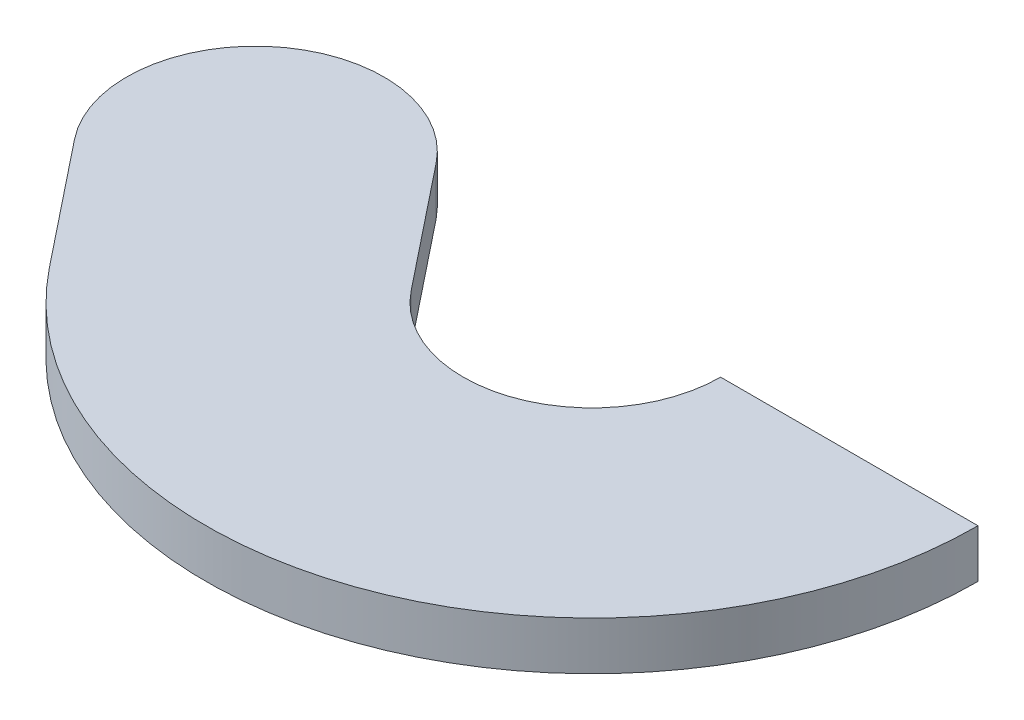
ISO-10303-21;
HEADER;
FILE_DESCRIPTION(('STEP AP214'),'2;1');
FILE_NAME('part.step','',(''),(''),'','','');
FILE_SCHEMA(('AUTOMOTIVE_DESIGN { 1 0 10303 214 1 1 1 1 }'));
ENDSEC;
DATA;
#1=APPLICATION_CONTEXT('core data for automotive mechanical design processes');
#2=APPLICATION_PROTOCOL_DEFINITION('international standard','automotive_design',2000,#1);
#3=PRODUCT_CONTEXT('',#1,'mechanical');
#4=PRODUCT('Part','Part','',(#3));
#5=PRODUCT_RELATED_PRODUCT_CATEGORY('part','',(#4));
#6=PRODUCT_DEFINITION_FORMATION('','',#4);
#7=PRODUCT_DEFINITION_CONTEXT('part definition',#1,'design');
#8=PRODUCT_DEFINITION('design','',#6,#7);
#9=PRODUCT_DEFINITION_SHAPE('','',#8);
#10=(LENGTH_UNIT() NAMED_UNIT(*) SI_UNIT(.MILLI.,.METRE.));
#11=(NAMED_UNIT(*) PLANE_ANGLE_UNIT() SI_UNIT($,.RADIAN.));
#12=(NAMED_UNIT(*) SI_UNIT($,.STERADIAN.) SOLID_ANGLE_UNIT());
#13=UNCERTAINTY_MEASURE_WITH_UNIT(LENGTH_MEASURE(1.E-05),#10,'distance_accuracy_value','');
#14=(GEOMETRIC_REPRESENTATION_CONTEXT(3) GLOBAL_UNCERTAINTY_ASSIGNED_CONTEXT((#13)) GLOBAL_UNIT_ASSIGNED_CONTEXT((#10,
#11,#12)) REPRESENTATION_CONTEXT('',''));
#15=CARTESIAN_POINT('',(0.,0.,0.));
#16=DIRECTION('',(0.,0.,1.));
#17=DIRECTION('',(1.,0.,0.));
#18=AXIS2_PLACEMENT_3D('',#15,#16,#17);
#19=CARTESIAN_POINT('',(0.,9.525,0.));
#20=DIRECTION('',(0.,-1.,0.));
#21=DIRECTION('',(0.,0.,-1.));
#22=AXIS2_PLACEMENT_3D('',#19,#20,#21);
#23=CYLINDRICAL_SURFACE('',#22,50.8);
#24=DIRECTION('',(0.,-1.,0.));
#25=VECTOR('',#24,1.);
#26=CARTESIAN_POINT('',(0.,9.525,50.8));
#27=LINE('',#26,#25);
#28=CARTESIAN_POINT('',(0.,-9.525,50.8));
#29=VERTEX_POINT('',#28);
#30=CARTESIAN_POINT('',(0.,9.525,50.8));
#31=VERTEX_POINT('',#30);
#32=EDGE_CURVE('E12',#29,#31,#27,.F.);
#33=ORIENTED_EDGE('',*,*,#32,.F.);
#34=CARTESIAN_POINT('',(0.,-9.525,0.));
#35=DIRECTION('',(0.,-1.,0.));
#36=DIRECTION('',(0.,0.,-1.));
#37=AXIS2_PLACEMENT_3D('',#34,#35,#36);
#38=CIRCLE('',#37,50.8);
#39=CARTESIAN_POINT('',(-39.728936036882,-9.525,31.65835815985));
#40=VERTEX_POINT('',#39);
#41=EDGE_CURVE('E145',#29,#40,#38,.T.);
#42=ORIENTED_EDGE('',*,*,#41,.T.);
#43=DIRECTION('',(0.,-1.,0.));
#44=VECTOR('',#43,1.);
#45=CARTESIAN_POINT('',(-39.728936036882,9.525,31.65835815985));
#46=LINE('',#45,#44);
#47=CARTESIAN_POINT('',(-39.728936036882,9.525,31.65835815985));
#48=VERTEX_POINT('',#47);
#49=EDGE_CURVE('E125',#48,#40,#46,.T.);
#50=ORIENTED_EDGE('',*,*,#49,.F.);
#51=CARTESIAN_POINT('',(0.,9.525,0.));
#52=DIRECTION('',(0.,-1.,0.));
#53=DIRECTION('',(0.,0.,-1.));
#54=AXIS2_PLACEMENT_3D('',#51,#52,#53);
#55=CIRCLE('',#54,50.8);
#56=EDGE_CURVE('E111',#31,#48,#55,.T.);
#57=ORIENTED_EDGE('',*,*,#56,.F.);
#58=EDGE_LOOP('',(#33,#42,#50,#57));
#59=FACE_BOUND('',#58,.T.);
#60=ADVANCED_FACE('F45',(#59),#23,.F.);
#61=CARTESIAN_POINT('',(0.,9.525,0.));
#62=DIRECTION('',(0.,-1.,0.));
#63=DIRECTION('',(0.,0.,-1.));
#64=AXIS2_PLACEMENT_3D('',#61,#62,#63);
#65=CYLINDRICAL_SURFACE('',#64,152.4);
#66=CARTESIAN_POINT('',(0.,-9.525,0.));
#67=DIRECTION('',(0.,1.,0.));
#68=DIRECTION('',(0.,0.,-1.));
#69=AXIS2_PLACEMENT_3D('',#66,#67,#68);
#70=CIRCLE('',#69,152.4);
#71=CARTESIAN_POINT('',(-119.186808110646,-9.525,94.9750744795499));
#72=VERTEX_POINT('',#71);
#73=CARTESIAN_POINT('',(152.4,-9.525,0.));
#74=VERTEX_POINT('',#73);
#75=EDGE_CURVE('E124',#72,#74,#70,.T.);
#76=ORIENTED_EDGE('',*,*,#75,.T.);
#77=DIRECTION('',(0.,-1.,0.));
#78=VECTOR('',#77,1.);
#79=CARTESIAN_POINT('',(152.4,9.525,0.));
#80=LINE('',#79,#78);
#81=CARTESIAN_POINT('',(152.4,9.525,0.));
#82=VERTEX_POINT('',#81);
#83=EDGE_CURVE('E54',#82,#74,#80,.T.);
#84=ORIENTED_EDGE('',*,*,#83,.F.);
#85=CARTESIAN_POINT('',(0.,9.525,0.));
#86=DIRECTION('',(0.,1.,0.));
#87=DIRECTION('',(0.,0.,-1.));
#88=AXIS2_PLACEMENT_3D('',#85,#86,#87);
#89=CIRCLE('',#88,152.4);
#90=CARTESIAN_POINT('',(-119.186808110646,9.525,94.9750744795499));
#91=VERTEX_POINT('',#90);
#92=EDGE_CURVE('E112',#91,#82,#89,.T.);
#93=ORIENTED_EDGE('',*,*,#92,.F.);
#94=DIRECTION('',(0.,-1.,0.));
#95=VECTOR('',#94,1.);
#96=CARTESIAN_POINT('',(-119.186808110646,9.525,94.9750744795499));
#97=LINE('',#96,#95);
#98=EDGE_CURVE('E136',#91,#72,#97,.T.);
#99=ORIENTED_EDGE('',*,*,#98,.T.);
#100=EDGE_LOOP('',(#76,#84,#93,#99));
#101=FACE_BOUND('',#100,.T.);
#102=ADVANCED_FACE('F47',(#101),#65,.T.);
#103=CARTESIAN_POINT('',(50.8,9.525,0.));
#104=DIRECTION('',(0.,0.,1.));
#105=DIRECTION('',(1.,0.,0.));
#106=AXIS2_PLACEMENT_3D('',#103,#104,#105);
#107=PLANE('',#106);
#108=DIRECTION('',(-1.,0.,0.));
#109=VECTOR('',#108,1.);
#110=CARTESIAN_POINT('',(50.8,-9.525,0.));
#111=LINE('',#110,#109);
#112=CARTESIAN_POINT('',(50.8,-9.525,0.));
#113=VERTEX_POINT('',#112);
#114=EDGE_CURVE('E146',#74,#113,#111,.T.);
#115=ORIENTED_EDGE('',*,*,#114,.T.);
#116=DIRECTION('',(0.,-1.,0.));
#117=VECTOR('',#116,1.);
#118=CARTESIAN_POINT('',(50.8,9.525,0.));
#119=LINE('',#118,#117);
#120=CARTESIAN_POINT('',(50.8,9.525,0.));
#121=VERTEX_POINT('',#120);
#122=EDGE_CURVE('E108',#121,#113,#119,.T.);
#123=ORIENTED_EDGE('',*,*,#122,.F.);
#124=DIRECTION('',(-1.,0.,0.));
#125=VECTOR('',#124,1.);
#126=CARTESIAN_POINT('',(50.8,9.525,0.));
#127=LINE('',#126,#125);
#128=EDGE_CURVE('E102',#82,#121,#127,.T.);
#129=ORIENTED_EDGE('',*,*,#128,.F.);
#130=ORIENTED_EDGE('',*,*,#83,.T.);
#131=EDGE_LOOP('',(#115,#123,#129,#130));
#132=FACE_BOUND('',#131,.T.);
#133=ADVANCED_FACE('F104',(#132),#107,.F.);
#134=EDGE_CURVE('E143',#113,#29,#38,.T.);
#135=ORIENTED_EDGE('',*,*,#134,.T.);
#136=ORIENTED_EDGE('',*,*,#32,.T.);
#137=EDGE_CURVE('E159',#121,#31,#55,.T.);
#138=ORIENTED_EDGE('',*,*,#137,.F.);
#139=ORIENTED_EDGE('',*,*,#122,.T.);
#140=EDGE_LOOP('',(#135,#136,#138,#139));
#141=FACE_BOUND('',#140,.T.);
#142=ADVANCED_FACE('F181',(#141),#23,.F.);
#143=CARTESIAN_POINT('',(-39.728936036882,9.525,31.65835815985));
#144=DIRECTION('',(-0.782065670017362,0.,0.623196026768701));
#145=DIRECTION('',(0.623196026768701,0.,0.782065670017361));
#146=AXIS2_PLACEMENT_3D('',#143,#144,#145);
#147=PLANE('',#146);
#148=DIRECTION('',(-0.623196026768701,0.,-0.782065670017361));
#149=VECTOR('',#148,1.);
#150=CARTESIAN_POINT('',(-39.728936036882,-9.525,31.65835815985));
#151=LINE('',#150,#149);
#152=CARTESIAN_POINT('',(-78.5524769614885,-9.525,-17.0623609100069));
#153=VERTEX_POINT('',#152);
#154=EDGE_CURVE('E141',#40,#153,#151,.T.);
#155=ORIENTED_EDGE('',*,*,#154,.T.);
#156=DIRECTION('',(0.,-1.,0.));
#157=VECTOR('',#156,1.);
#158=CARTESIAN_POINT('',(-78.5524769614885,9.525,-17.0623609100069));
#159=LINE('',#158,#157);
#160=CARTESIAN_POINT('',(-78.5524769614885,9.525,-17.0623609100069));
#161=VERTEX_POINT('',#160);
#162=EDGE_CURVE('E130',#161,#153,#159,.T.);
#163=ORIENTED_EDGE('',*,*,#162,.F.);
#164=DIRECTION('',(-0.623196026768701,0.,-0.782065670017361));
#165=VECTOR('',#164,1.);
#166=CARTESIAN_POINT('',(-39.728936036882,9.525,31.65835815985));
#167=LINE('',#166,#165);
#168=EDGE_CURVE('E153',#48,#161,#167,.T.);
#169=ORIENTED_EDGE('',*,*,#168,.F.);
#170=ORIENTED_EDGE('',*,*,#49,.T.);
#171=EDGE_LOOP('',(#155,#163,#169,#170));
#172=FACE_BOUND('',#171,.T.);
#173=ADVANCED_FACE('F169',(#172),#147,.F.);
#174=CARTESIAN_POINT('',(-118.28141299837,9.525,14.5959972498431));
#175=DIRECTION('',(0.,-1.,0.));
#176=DIRECTION('',(0.,0.,-1.));
#177=AXIS2_PLACEMENT_3D('',#174,#175,#176);
#178=CYLINDRICAL_SURFACE('',#177,50.8);
#179=CARTESIAN_POINT('',(-118.28141299837,-9.525,14.5959972498431));
#180=DIRECTION('',(0.,1.,0.));
#181=DIRECTION('',(0.,0.,-1.));
#182=AXIS2_PLACEMENT_3D('',#179,#180,#181);
#183=CIRCLE('',#182,50.8);
#184=CARTESIAN_POINT('',(-158.010349035252,-9.525,46.2543554096931));
#185=VERTEX_POINT('',#184);
#186=EDGE_CURVE('E139',#153,#185,#183,.T.);
#187=ORIENTED_EDGE('',*,*,#186,.T.);
#188=DIRECTION('',(0.,-1.,0.));
#189=VECTOR('',#188,1.);
#190=CARTESIAN_POINT('',(-158.010349035252,9.525,46.2543554096931));
#191=LINE('',#190,#189);
#192=CARTESIAN_POINT('',(-158.010349035252,9.525,46.2543554096931));
#193=VERTEX_POINT('',#192);
#194=EDGE_CURVE('E133',#193,#185,#191,.T.);
#195=ORIENTED_EDGE('',*,*,#194,.F.);
#196=CARTESIAN_POINT('',(-118.28141299837,9.525,14.5959972498431));
#197=DIRECTION('',(0.,1.,0.));
#198=DIRECTION('',(0.,0.,-1.));
#199=AXIS2_PLACEMENT_3D('',#196,#197,#198);
#200=CIRCLE('',#199,50.8);
#201=EDGE_CURVE('E150',#161,#193,#200,.T.);
#202=ORIENTED_EDGE('',*,*,#201,.F.);
#203=ORIENTED_EDGE('',*,*,#162,.T.);
#204=EDGE_LOOP('',(#187,#195,#202,#203));
#205=FACE_BOUND('',#204,.T.);
#206=ADVANCED_FACE('F174',(#205),#178,.T.);
#207=CARTESIAN_POINT('',(-119.186808110646,9.525,94.9750744795499));
#208=DIRECTION('',(0.782065670017363,0.,-0.6231960267687));
#209=DIRECTION('',(-0.6231960267687,0.,-0.782065670017363));
#210=AXIS2_PLACEMENT_3D('',#207,#208,#209);
#211=PLANE('',#210);
#212=DIRECTION('',(0.6231960267687,0.,0.782065670017362));
#213=VECTOR('',#212,1.);
#214=CARTESIAN_POINT('',(-119.186808110646,-9.525,94.9750744795499));
#215=LINE('',#214,#213);
#216=EDGE_CURVE('E121',#185,#72,#215,.T.);
#217=ORIENTED_EDGE('',*,*,#216,.T.);
#218=ORIENTED_EDGE('',*,*,#98,.F.);
#219=DIRECTION('',(0.6231960267687,0.,0.782065670017362));
#220=VECTOR('',#219,1.);
#221=CARTESIAN_POINT('',(-119.186808110646,9.525,94.9750744795499));
#222=LINE('',#221,#220);
#223=EDGE_CURVE('E117',#193,#91,#222,.T.);
#224=ORIENTED_EDGE('',*,*,#223,.F.);
#225=ORIENTED_EDGE('',*,*,#194,.T.);
#226=EDGE_LOOP('',(#217,#218,#224,#225));
#227=FACE_BOUND('',#226,.T.);
#228=ADVANCED_FACE('F177',(#227),#211,.F.);
#229=CARTESIAN_POINT('',(0.,9.525,0.));
#230=DIRECTION('',(0.,-1.,0.));
#231=DIRECTION('',(0.,0.,-1.));
#232=AXIS2_PLACEMENT_3D('',#229,#230,#231);
#233=PLANE('',#232);
#234=ORIENTED_EDGE('',*,*,#92,.T.);
#235=ORIENTED_EDGE('',*,*,#128,.T.);
#236=ORIENTED_EDGE('',*,*,#137,.T.);
#237=ORIENTED_EDGE('',*,*,#56,.T.);
#238=ORIENTED_EDGE('',*,*,#168,.T.);
#239=ORIENTED_EDGE('',*,*,#201,.T.);
#240=ORIENTED_EDGE('',*,*,#223,.T.);
#241=EDGE_LOOP('',(#234,#235,#236,#237,#238,#239,#240));
#242=FACE_BOUND('',#241,.T.);
#243=ADVANCED_FACE('F115',(#242),#233,.F.);
#244=CARTESIAN_POINT('',(0.,-9.525,0.));
#245=DIRECTION('',(0.,-1.,0.));
#246=DIRECTION('',(0.,0.,-1.));
#247=AXIS2_PLACEMENT_3D('',#244,#245,#246);
#248=PLANE('',#247);
#249=ORIENTED_EDGE('',*,*,#75,.F.);
#250=ORIENTED_EDGE('',*,*,#216,.F.);
#251=ORIENTED_EDGE('',*,*,#186,.F.);
#252=ORIENTED_EDGE('',*,*,#154,.F.);
#253=ORIENTED_EDGE('',*,*,#41,.F.);
#254=ORIENTED_EDGE('',*,*,#134,.F.);
#255=ORIENTED_EDGE('',*,*,#114,.F.);
#256=EDGE_LOOP('',(#249,#250,#251,#252,#253,#254,#255));
#257=FACE_BOUND('',#256,.T.);
#258=ADVANCED_FACE('F179',(#257),#248,.T.);
#259=CLOSED_SHELL('',(#60,#102,#133,#142,#173,#206,#228,#243,#258));
#260=MANIFOLD_SOLID_BREP('B2',#259);
#261=ADVANCED_BREP_SHAPE_REPRESENTATION('',(#18,#260),#14);
#262=SHAPE_DEFINITION_REPRESENTATION(#9,#261);
ENDSEC;
END-ISO-10303-21;
